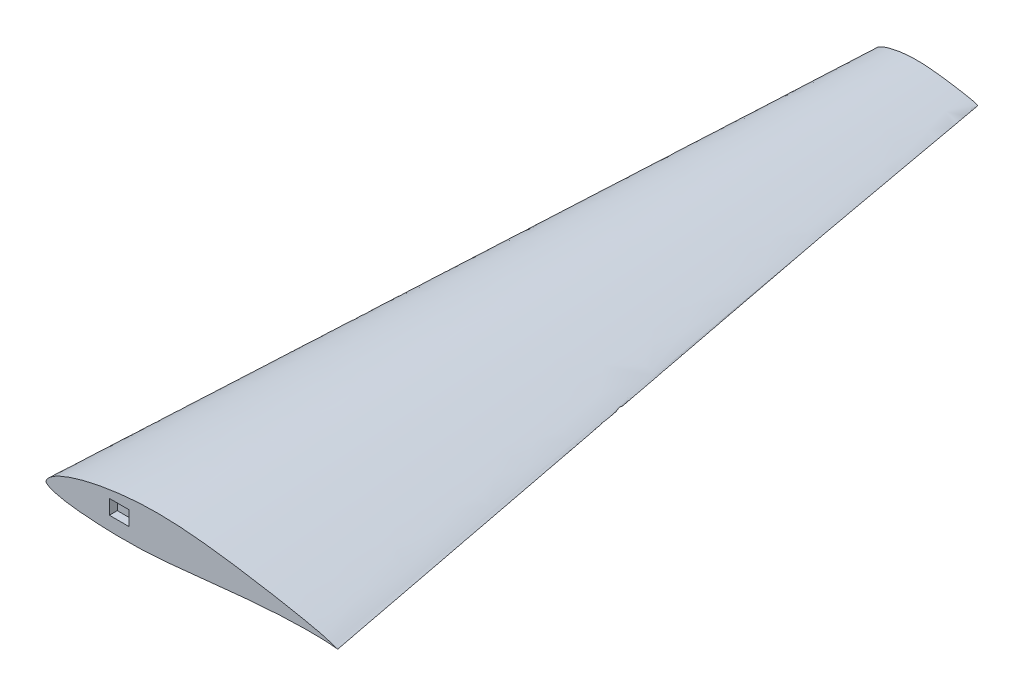
ISO-10303-21;
HEADER;
FILE_DESCRIPTION(('STEP AP214'),'2;1');
FILE_NAME('part.step','',(''),(''),'','','');
FILE_SCHEMA(('AUTOMOTIVE_DESIGN { 1 0 10303 214 1 1 1 1 }'));
ENDSEC;
DATA;
#1=APPLICATION_CONTEXT('core data for automotive mechanical design processes');
#2=APPLICATION_PROTOCOL_DEFINITION('international standard','automotive_design',2000,#1);
#3=PRODUCT_CONTEXT('',#1,'mechanical');
#4=PRODUCT('Part','Part','',(#3));
#5=PRODUCT_RELATED_PRODUCT_CATEGORY('part','',(#4));
#6=PRODUCT_DEFINITION_FORMATION('','',#4);
#7=PRODUCT_DEFINITION_CONTEXT('part definition',#1,'design');
#8=PRODUCT_DEFINITION('design','',#6,#7);
#9=PRODUCT_DEFINITION_SHAPE('','',#8);
#10=(LENGTH_UNIT() NAMED_UNIT(*) SI_UNIT(.MILLI.,.METRE.));
#11=(NAMED_UNIT(*) PLANE_ANGLE_UNIT() SI_UNIT($,.RADIAN.));
#12=(NAMED_UNIT(*) SI_UNIT($,.STERADIAN.) SOLID_ANGLE_UNIT());
#13=UNCERTAINTY_MEASURE_WITH_UNIT(LENGTH_MEASURE(1.E-05),#10,'distance_accuracy_value','');
#14=(GEOMETRIC_REPRESENTATION_CONTEXT(3) GLOBAL_UNCERTAINTY_ASSIGNED_CONTEXT((#13)) GLOBAL_UNIT_ASSIGNED_CONTEXT((#10,
#11,#12)) REPRESENTATION_CONTEXT('',''));
#15=CARTESIAN_POINT('',(0.,0.,0.));
#16=DIRECTION('',(0.,0.,1.));
#17=DIRECTION('',(1.,0.,0.));
#18=AXIS2_PLACEMENT_3D('',#15,#16,#17);
#19=CARTESIAN_POINT('',(-1152.26626391296,-12.2003702878728,-60.));
#20=DIRECTION('',(0.,0.,1.));
#21=DIRECTION('',(-1.,0.,0.));
#22=AXIS2_PLACEMENT_3D('',#19,#20,#21);
#23=PLANE('',#22);
#24=CARTESIAN_POINT('',(1122.2058981927,-30.8287655417814,-60.));
#25=CARTESIAN_POINT('',(1122.20115465393,-30.616714157466,-60.));
#26=CARTESIAN_POINT('',(1105.88259010497,-26.302372430673,-60.));
#27=CARTESIAN_POINT('',(1090.45754080574,-20.128829088461,-60.));
#28=CARTESIAN_POINT('',(1054.9512815124,-7.99563699588107,-60.));
#29=CARTESIAN_POINT('',(1012.29599935876,4.66375979651589,-60.));
#30=CARTESIAN_POINT('',(957.04784294867,17.8507612083849,-60.));
#31=CARTESIAN_POINT('',(891.716447525941,32.0367462273664,-60.));
#32=CARTESIAN_POINT('',(816.215341075556,47.3863666228463,-60.));
#33=CARTESIAN_POINT('',(731.9107718024,63.6704700489651,-60.));
#34=CARTESIAN_POINT('',(639.904104118504,80.6119651921873,-60.));
#35=CARTESIAN_POINT('',(541.510109284894,97.9167515276931,-60.));
#36=CARTESIAN_POINT('',(438.007613140291,115.09581096489,-60.));
#37=CARTESIAN_POINT('',(330.759268640408,131.748835691453,-60.));
#38=CARTESIAN_POINT('',(221.067545036545,147.33360763959,-60.));
#39=CARTESIAN_POINT('',(110.235704933439,161.251005054439,-60.));
#40=CARTESIAN_POINT('',(-0.492989421787764,172.997502315641,-60.));
#41=CARTESIAN_POINT('',(-110.055608812469,181.858679944371,-60.));
#42=CARTESIAN_POINT('',(-217.651628228843,186.906082107041,-60.));
#43=CARTESIAN_POINT('',(-322.67239779899,187.859019165266,-60.));
#44=CARTESIAN_POINT('',(-424.675493361954,184.483085412563,-60.));
#45=CARTESIAN_POINT('',(-523.162611524368,176.999526502167,-60.));
#46=CARTESIAN_POINT('',(-617.503498840836,166.17093241627,-60.));
#47=CARTESIAN_POINT('',(-706.884266129657,152.666711489326,-60.));
#48=CARTESIAN_POINT('',(-790.352428612782,136.7369598375,-60.));
#49=CARTESIAN_POINT('',(-867.056319021184,118.888986738304,-60.));
#50=CARTESIAN_POINT('',(-936.208246875165,99.5088027623838,-60.));
#51=CARTESIAN_POINT('',(-997.069117294322,79.0241834004041,-60.));
#52=CARTESIAN_POINT('',(-1049.04466548759,57.9027726884214,-60.));
#53=CARTESIAN_POINT('',(-1091.63364572143,36.4478589204407,-60.));
#54=CARTESIAN_POINT('',(-1124.4685862203,15.1942829283517,-60.));
#55=CARTESIAN_POINT('',(-1143.38688648303,-1.40670261872229,-60.));
#56=CARTESIAN_POINT('',(-1153.8658987359,-14.0298144732624,-60.));
#57=CARTESIAN_POINT('',(-1158.69837124572,-21.3015870958212,-60.));
#58=CARTESIAN_POINT('',(-1161.96116557527,-29.0987523051228,-60.));
#59=CARTESIAN_POINT('',(-1162.89877256632,-33.8886922166885,-60.));
#60=CARTESIAN_POINT('',(-1162.72232265553,-37.2464304163831,-60.));
#61=CARTESIAN_POINT('',(-1161.37641018475,-40.4051635389474,-60.));
#62=CARTESIAN_POINT('',(-1158.2300863755,-44.4654169714448,-60.));
#63=CARTESIAN_POINT('',(-1151.51850668726,-50.6376219777177,-60.));
#64=CARTESIAN_POINT('',(-1138.20791379313,-59.2163676999068,-60.));
#65=CARTESIAN_POINT('',(-1113.63504585877,-70.0566519156926,-60.));
#66=CARTESIAN_POINT('',(-1076.23988302444,-81.3980510511196,-60.));
#67=CARTESIAN_POINT('',(-1026.0445928557,-92.1030957383134,-60.));
#68=CARTESIAN_POINT('',(-965.229779180064,-101.401943352952,-60.));
#69=CARTESIAN_POINT('',(-894.477580423596,-109.465652354948,-60.));
#70=CARTESIAN_POINT('',(-814.631371427864,-116.09531772094,-60.));
#71=CARTESIAN_POINT('',(-726.709924863051,-121.102769823313,-60.));
#72=CARTESIAN_POINT('',(-631.81325792365,-124.293074846313,-60.));
#73=CARTESIAN_POINT('',(-530.963310823338,-125.211188342904,-60.));
#74=CARTESIAN_POINT('',(-425.034225737718,-123.236314136182,-60.));
#75=CARTESIAN_POINT('',(-314.643586800013,-117.974381898108,-60.));
#76=CARTESIAN_POINT('',(-200.156938848306,-109.126499791224,-60.));
#77=CARTESIAN_POINT('',(-81.9662502529353,-97.1903427138153,-60.));
#78=CARTESIAN_POINT('',(39.2547979910437,-83.9633310166969,-60.));
#79=CARTESIAN_POINT('',(162.164059051418,-70.4688237938537,-60.));
#80=CARTESIAN_POINT('',(285.030589665615,-57.6215109480256,-60.));
#81=CARTESIAN_POINT('',(406.008310953053,-46.0046138520639,-60.));
#82=CARTESIAN_POINT('',(523.188405612224,-36.2734456824879,-60.));
#83=CARTESIAN_POINT('',(634.631068124435,-28.7415065353594,-60.));
#84=CARTESIAN_POINT('',(738.378890591227,-23.5276764186368,-60.));
#85=CARTESIAN_POINT('',(832.710900485001,-20.777613140111,-60.));
#86=CARTESIAN_POINT('',(915.531746960598,-20.0924410267603,-60.));
#87=CARTESIAN_POINT('',(986.359954304663,-21.3847433442597,-60.));
#88=CARTESIAN_POINT('',(1040.98056697541,-23.3379611282725,-60.));
#89=CARTESIAN_POINT('',(1085.64373290725,-26.9172743422512,-60.));
#90=CARTESIAN_POINT('',(1104.13634536753,-28.0221898809687,-60.));
#91=CARTESIAN_POINT('',(1122.21079812224,-31.0478080945832,-60.));
#92=CARTESIAN_POINT('',(1122.2058981927,-30.8287655417814,-60.));
#93=B_SPLINE_CURVE_WITH_KNOTS('',3,(#24,#25,#26,#27,#28,#29,#30,#31,#32,#33,#34,#35,#36,#37,#38,
#39,#40,#41,#42,#43,#44,#45,#46,#47,#48,#49,#50,#51,#52,#53,#54,#55,#56,#57,#58,#59,#60,#61,#62,
#63,#64,#65,#66,#67,#68,#69,#70,#71,#72,#73,#74,#75,#76,#77,#78,#79,#80,#81,#82,#83,#84,#85,#86,
#87,#88,#89,#90,#91,#92),.UNSPECIFIED.,.T.,.F.,(4,1,1,1,1,1,1,1,1,1,1,1,1,1,1,1,1,1,1,1,1,1,1,1,
1,1,1,1,1,1,1,1,1,1,1,1,1,1,1,1,1,1,1,1,1,1,1,1,1,1,1,1,1,1,1,1,1,1,1,1,1,1,1,1,1,1,4),(0.,
0.00178025429931348,0.00677661855276226,0.014307631931115,0.0240462466109695,0.0361164032384218,
0.0505469730630571,0.0671298835400742,0.0856244289456062,0.10576729194862,0.127282098412942,
0.149864114045041,0.173229760189317,0.197069077892929,0.221103034083199,0.245051957369849,
0.268663179942347,0.291772797822348,0.314298508345449,0.336177511433891,0.357377359215959,
0.377791670496789,0.397224888102935,0.415489312865215,0.432417328029751,0.447849235180273,
0.461650757544391,0.473686992386839,0.483898395757803,0.492262508108233,0.498796820958936,
0.499955027372734,0.502810607326279,0.504371243067385,0.50535998755193,0.505924933279694,
0.506503368203689,0.507535007041587,0.509204749770686,0.512345281497249,0.517665407870953,
0.526421681932562,0.537424925562334,0.550643204547595,0.565965823835836,0.583206168779579,
0.6021549785986,0.622586582637333,0.644254823208852,0.666997978581174,0.690702845759673,
0.715307475272001,0.740824202204505,0.767084355637659,0.793717038600972,0.82033109971691,
0.846519300878587,0.871863223081629,0.895937170924907,0.918334876492831,0.938667169413558,
0.956573464196435,0.971715275283217,0.983839006179547,0.992717916559063,0.998161052107173,1.),.UNSPECIFIED.);
#94=CARTESIAN_POINT('',(1122.2058981927,-30.8287655417814,-60.));
#95=VERTEX_POINT('',#94);
#96=EDGE_CURVE('E75',#95,#95,#93,.T.);
#97=ORIENTED_EDGE('',*,*,#96,.T.);
#98=EDGE_LOOP('',(#97));
#99=FACE_BOUND('',#98,.T.);
#100=DIRECTION('',(1.,0.,0.));
#101=VECTOR('',#100,1.);
#102=CARTESIAN_POINT('',(-513.594303372642,97.9458802101725,-60.));
#103=LINE('',#102,#101);
#104=CARTESIAN_POINT('',(-666.619485216032,97.9458802101725,-60.));
#105=VERTEX_POINT('',#104);
#106=CARTESIAN_POINT('',(-513.594303372642,97.9458802101725,-60.));
#107=VERTEX_POINT('',#106);
#108=EDGE_CURVE('E113',#105,#107,#103,.T.);
#109=ORIENTED_EDGE('',*,*,#108,.T.);
#110=DIRECTION('',(0.,-1.,0.));
#111=VECTOR('',#110,1.);
#112=CARTESIAN_POINT('',(-513.594303372642,97.9458802101725,-60.));
#113=LINE('',#112,#111);
#114=CARTESIAN_POINT('',(-513.594303372642,-16.2780466428138,-60.));
#115=VERTEX_POINT('',#114);
#116=EDGE_CURVE('E90',#107,#115,#113,.T.);
#117=ORIENTED_EDGE('',*,*,#116,.T.);
#118=DIRECTION('',(-1.,0.,0.));
#119=VECTOR('',#118,1.);
#120=CARTESIAN_POINT('',(-513.594303372642,-16.2780466428138,-60.));
#121=LINE('',#120,#119);
#122=CARTESIAN_POINT('',(-666.619485216032,-16.2780466428138,-60.));
#123=VERTEX_POINT('',#122);
#124=EDGE_CURVE('E142',#115,#123,#121,.T.);
#125=ORIENTED_EDGE('',*,*,#124,.T.);
#126=DIRECTION('',(0.,1.,0.));
#127=VECTOR('',#126,1.);
#128=CARTESIAN_POINT('',(-666.619485216032,97.9458802101725,-60.));
#129=LINE('',#128,#127);
#130=EDGE_CURVE('E135',#123,#105,#129,.T.);
#131=ORIENTED_EDGE('',*,*,#130,.T.);
#132=EDGE_LOOP('',(#109,#117,#125,#131));
#133=FACE_BOUND('',#132,.T.);
#134=ADVANCED_FACE('F63',(#99,#133),#23,.T.);
#135=CARTESIAN_POINT('',(-856.653077521207,-40.6182657315667,-6260.));
#136=DIRECTION('',(0.,0.,1.));
#137=DIRECTION('',(-1.,0.,0.));
#138=AXIS2_PLACEMENT_3D('',#135,#136,#137);
#139=PLANE('',#138);
#140=CARTESIAN_POINT('',(-62.768795980493,-35.2354448345607,-6260.));
#141=CARTESIAN_POINT('',(-62.7715594343637,-35.161464044046,-6260.));
#142=CARTESIAN_POINT('',(-68.4892533402153,-33.7410304315181,-6260.));
#143=CARTESIAN_POINT('',(-73.904826244995,-31.6670699807893,-6260.));
#144=CARTESIAN_POINT('',(-86.3598466861363,-27.6181263346662,-6260.));
#145=CARTESIAN_POINT('',(-101.312613463051,-23.4228917248776,-6260.));
#146=CARTESIAN_POINT('',(-120.663028845652,-19.1093216631822,-6260.));
#147=CARTESIAN_POINT('',(-143.537697318301,-14.4997928532483,-6260.));
#148=CARTESIAN_POINT('',(-169.96765777261,-9.5372939208794,-6260.));
#149=CARTESIAN_POINT('',(-199.474894570233,-4.29466001199642,-6260.));
#150=CARTESIAN_POINT('',(-231.673585589033,1.13715909285272,-6260.));
#151=CARTESIAN_POINT('',(-266.103341203516,6.66239247620247,-6260.));
#152=CARTESIAN_POINT('',(-302.315298237174,12.1170555043395,-6260.));
#153=CARTESIAN_POINT('',(-339.831801501577,17.3685612770775,-6260.));
#154=CARTESIAN_POINT('',(-378.195458339637,22.2344819950382,-6260.));
#155=CARTESIAN_POINT('',(-416.948301893932,26.5125347132972,-6260.));
#156=CARTESIAN_POINT('',(-455.653804819709,30.0334858752315,-6260.));
#157=CARTESIAN_POINT('',(-493.937273776908,32.5535580846316,-6260.));
#158=CARTESIAN_POINT('',(-531.514475712799,33.7529045585345,-6260.));
#159=CARTESIAN_POINT('',(-568.17152624748,33.5367452774346,-6260.));
#160=CARTESIAN_POINT('',(-603.752795326995,31.8255847079449,-6260.));
#161=CARTESIAN_POINT('',(-638.085531914352,28.6992408412461,-6260.));
#162=CARTESIAN_POINT('',(-670.953763146873,24.4271493642645,-6260.));
#163=CARTESIAN_POINT('',(-702.076940726259,19.2471852213284,-6260.));
#164=CARTESIAN_POINT('',(-731.123955821754,13.2516082607377,-6260.));
#165=CARTESIAN_POINT('',(-757.800228679982,6.62191851956731,-6260.));
#166=CARTESIAN_POINT('',(-781.832873554333,-0.503051287442359,-6260.));
#167=CARTESIAN_POINT('',(-802.96618270177,-7.97014647053786,-6260.));
#168=CARTESIAN_POINT('',(-820.995202148996,-15.6130550209624,-6260.));
#169=CARTESIAN_POINT('',(-835.74658265942,-23.3233108305785,-6260.));
#170=CARTESIAN_POINT('',(-847.09487174238,-30.9123353139702,-6260.));
#171=CARTESIAN_POINT('',(-853.610586604553,-36.8048992419908,-6260.));
#172=CARTESIAN_POINT('',(-857.201788544685,-41.2650967461758,-6260.));
#173=CARTESIAN_POINT('',(-858.850318344285,-43.828182757875,-6260.));
#174=CARTESIAN_POINT('',(-859.94828793429,-46.5664283398626,-6260.));
#175=CARTESIAN_POINT('',(-860.250483793828,-48.2430082792743,-6260.));
#176=CARTESIAN_POINT('',(-860.171358916499,-49.4139312981977,-6260.));
#177=CARTESIAN_POINT('',(-859.685133378202,-50.5092914480428,-6260.));
#178=CARTESIAN_POINT('',(-858.565856882824,-51.9098735302076,-6260.));
#179=CARTESIAN_POINT('',(-856.191277168439,-54.0288947151431,-6260.));
#180=CARTESIAN_POINT('',(-851.501078818877,-56.9533147580623,-6260.));
#181=CARTESIAN_POINT('',(-842.868548954772,-60.6081626209987,-6260.));
#182=CARTESIAN_POINT('',(-829.75844147582,-64.3709023541952,-6260.));
#183=CARTESIAN_POINT('',(-812.184436093652,-67.8446748921428,-6260.));
#184=CARTESIAN_POINT('',(-790.911582287878,-70.772200095514,-6260.));
#185=CARTESIAN_POINT('',(-766.177051439535,-73.2167412462913,-6260.));
#186=CARTESIAN_POINT('',(-738.276219223052,-75.1132874538173,-6260.));
#187=CARTESIAN_POINT('',(-707.56561876685,-76.4014909147392,-6260.));
#188=CARTESIAN_POINT('',(-674.43017274413,-77.0190676374616,-6260.));
#189=CARTESIAN_POINT('',(-639.228914169513,-76.8125475071701,-6260.));
#190=CARTESIAN_POINT('',(-602.270160843118,-75.5698410912889,-6260.));
#191=CARTESIAN_POINT('',(-563.771507600199,-73.1566453823038,-6260.));
#192=CARTESIAN_POINT('',(-523.862090680234,-69.4705576020164,-6260.));
#193=CARTESIAN_POINT('',(-482.676106035862,-64.6873134822189,-6260.));
#194=CARTESIAN_POINT('',(-440.43927569069,-59.4377296716919,-6260.));
#195=CARTESIAN_POINT('',(-397.614659582081,-54.0859694749774,-6260.));
#196=CARTESIAN_POINT('',(-354.801574741511,-48.9603022904963,-6260.));
#197=CARTESIAN_POINT('',(-312.641252257449,-44.2739171415237,-6260.));
#198=CARTESIAN_POINT('',(-271.796442142331,-40.2654907769843,-6260.));
#199=CARTESIAN_POINT('',(-232.942495214821,-37.0545696704387,-6260.));
#200=CARTESIAN_POINT('',(-196.761922382884,-34.6928701852552,-6260.));
#201=CARTESIAN_POINT('',(-163.854579095046,-33.2402187187982,-6260.));
#202=CARTESIAN_POINT('',(-134.953823384428,-32.5683565258773,-6260.));
#203=CARTESIAN_POINT('',(-110.228146214666,-32.6492910205264,-6260.));
#204=CARTESIAN_POINT('',(-91.155438971044,-33.0455684548176,-6260.));
#205=CARTESIAN_POINT('',(-75.5493675084802,-34.0613780335465,-6260.));
#206=CARTESIAN_POINT('',(-69.0897037754122,-34.3503679361492,-6260.));
#207=CARTESIAN_POINT('',(-62.7659414177071,-35.311864713945,-6260.));
#208=CARTESIAN_POINT('',(-62.768795980493,-35.2354448345607,-6260.));
#209=B_SPLINE_CURVE_WITH_KNOTS('',3,(#140,#141,#142,#143,#144,#145,#146,#147,#148,#149,#150,
#151,#152,#153,#154,#155,#156,#157,#158,#159,#160,#161,#162,#163,#164,#165,#166,#167,#168,#169,
#170,#171,#172,#173,#174,#175,#176,#177,#178,#179,#180,#181,#182,#183,#184,#185,#186,#187,#188,
#189,#190,#191,#192,#193,#194,#195,#196,#197,#198,#199,#200,#201,#202,#203,#204,#205,#206,#207,
#208),.UNSPECIFIED.,.T.,.F.,(4,1,1,1,1,1,1,1,1,1,1,1,1,1,1,1,1,1,1,1,1,1,1,1,1,1,1,1,1,1,1,1,1,
1,1,1,1,1,1,1,1,1,1,1,1,1,1,1,1,1,1,1,1,1,1,1,1,1,1,1,1,1,1,1,1,1,4),(0.,0.00178025429931348,
0.00677661855276226,0.014307631931115,0.0240462466109695,0.0361164032384218,0.0505469730630571,
0.0671298835400742,0.0856244289456062,0.10576729194862,0.127282098412942,0.149864114045041,
0.173229760189317,0.197069077892929,0.221103034083199,0.245051957369849,0.268663179942347,
0.291772797822348,0.314298508345449,0.336177511433891,0.357377359215959,0.377791670496789,
0.397224888102935,0.415489312865215,0.432417328029751,0.447849235180273,0.461650757544391,
0.473686992386839,0.483898395757803,0.492262508108233,0.498796820958936,0.499955027372734,
0.502810607326279,0.504371243067385,0.50535998755193,0.505924933279694,0.506503368203689,
0.507535007041587,0.509204749770686,0.512345281497249,0.517665407870953,0.526421681932562,
0.537424925562334,0.550643204547595,0.565965823835836,0.583206168779579,0.6021549785986,
0.622586582637333,0.644254823208852,0.666997978581174,0.690702845759673,0.715307475272001,
0.740824202204505,0.767084355637659,0.793717038600972,0.82033109971691,0.846519300878587,
0.871863223081629,0.895937170924907,0.918334876492831,0.938667169413558,0.956573464196435,
0.971715275283217,0.983839006179547,0.992717916559063,0.998161052107173,1.),.UNSPECIFIED.);
#210=CARTESIAN_POINT('',(-62.768795980493,-35.2354448345607,-6260.));
#211=VERTEX_POINT('',#210);
#212=EDGE_CURVE('E14',#211,#211,#209,.T.);
#213=ORIENTED_EDGE('',*,*,#212,.F.);
#214=EDGE_LOOP('',(#213));
#215=FACE_BOUND('',#214,.T.);
#216=ADVANCED_FACE('F65',(#215),#139,.F.);
#217=CARTESIAN_POINT('',(-829.212772496665,127.551706357056,-60.));
#218=CARTESIAN_POINT('',(-729.58238945558,13.4038053108561,-6260.));
#219=CARTESIAN_POINT('',(-831.317274890692,127.061718606732,-60.));
#220=CARTESIAN_POINT('',(-730.318211721742,13.2383485653586,-6260.));
#221=CARTESIAN_POINT('',(-844.668148264337,123.928740686031,-60.));
#222=CARTESIAN_POINT('',(-734.986497610126,12.1809427873616,-6260.));
#223=CARTESIAN_POINT('',(-872.329771938532,117.109052219102,-60.));
#224=CARTESIAN_POINT('',(-744.662471920196,9.88696426547185,-6260.));
#225=CARTESIAN_POINT('',(-906.646678696621,107.793584513178,-60.));
#226=CARTESIAN_POINT('',(-756.67522169935,6.77052491164006,-6260.));
#227=CARTESIAN_POINT('',(-943.806753069503,96.7062821112164,-60.));
#228=CARTESIAN_POINT('',(-769.701597856569,3.09351386462406,-6260.));
#229=CARTESIAN_POINT('',(-972.975630231256,87.1335960359868,-60.));
#230=CARTESIAN_POINT('',(-779.941039136108,-0.0587731598857236,-6260.));
#231=CARTESIAN_POINT('',(-1007.05666113912,74.800467805899,-60.));
#232=CARTESIAN_POINT('',(-791.937939174986,-4.07350427681673,-6260.));
#233=CARTESIAN_POINT('',(-1030.66516722207,65.3716873038617,-60.));
#234=CARTESIAN_POINT('',(-800.271635923456,-7.11409770871183,-6260.));
#235=CARTESIAN_POINT('',(-1061.25131138476,51.6962297013703,-60.));
#236=CARTESIAN_POINT('',(-811.137073165823,-11.4339714874833,-6260.));
#237=CARTESIAN_POINT('',(-1079.00722114432,42.8086322710204,-60.));
#238=CARTESIAN_POINT('',(-817.485959529064,-14.1945671402748,-6260.));
#239=CARTESIAN_POINT('',(-1104.0563484032,28.4068254523512,-60.));
#240=CARTESIAN_POINT('',(-826.581899048501,-18.5570678431818,-6260.));
#241=CARTESIAN_POINT('',(-1117.40931977586,19.7636426879801,-60.));
#242=CARTESIAN_POINT('',(-831.50107274205,-21.1272097641271,-6260.));
#243=CARTESIAN_POINT('',(-1135.66170921193,5.37221274075266,-60.));
#244=CARTESIAN_POINT('',(-838.462484807711,-25.2462877286109,-6260.));
#245=CARTESIAN_POINT('',(-1144.51533440074,-2.76604107005167,-60.));
#246=CARTESIAN_POINT('',(-841.975859971961,-27.5093717871831,-6260.));
#247=CARTESIAN_POINT('',(-1152.82466426129,-12.7755341152811,-60.));
#248=CARTESIAN_POINT('',(-845.654984774398,-30.176591122042,-6260.));
#249=CARTESIAN_POINT('',(-1156.43685610927,-17.8985208970397,-60.));
#250=CARTESIAN_POINT('',(-847.387479055175,-31.5040720435642,-6260.));
#251=CARTESIAN_POINT('',(-1159.78948712803,-23.9090486571599,-60.));
#252=CARTESIAN_POINT('',(-849.254612158242,-33.0194591670761,-6260.));
#253=CARTESIAN_POINT('',(-1161.96116557527,-29.0987523051228,-60.));
#254=CARTESIAN_POINT('',(-850.738397935686,-34.2990813241094,-6260.));
#255=CARTESIAN_POINT('',(-1162.89877256632,-33.8886922166885,-60.));
#256=CARTESIAN_POINT('',(-851.981208617759,-35.4505936480285,-6260.));
#257=CARTESIAN_POINT('',(-1162.72232265553,-37.2464304163831,-60.));
#258=CARTESIAN_POINT('',(-852.811957439663,-36.2586543969076,-6260.));
#259=CARTESIAN_POINT('',(-1161.37641018475,-40.4051635389474,-60.));
#260=CARTESIAN_POINT('',(-853.643168007229,-37.0983983043348,-6260.));
#261=CARTESIAN_POINT('',(-1159.10106133558,-43.3414452235634,-60.));
#262=CARTESIAN_POINT('',(-854.522834034568,-38.0388249855981,-6260.));
#263=CARTESIAN_POINT('',(-1156.16964821432,-46.3602684556404,-60.));
#264=CARTESIAN_POINT('',(-855.486598587112,-39.1434251619636,-6260.));
#265=CARTESIAN_POINT('',(-1153.91361001837,-48.3250763254306,-60.));
#266=CARTESIAN_POINT('',(-856.144369435414,-39.9518043859372,-6260.));
#267=CARTESIAN_POINT('',(-1149.03786328623,-52.2298240683766,-60.));
#268=CARTESIAN_POINT('',(-857.470291301179,-41.6825569943552,-6260.));
#269=CARTESIAN_POINT('',(-1144.90446537918,-54.8737396933434,-60.));
#270=CARTESIAN_POINT('',(-858.399044100502,-43.1265547363725,-6260.));
#271=CARTESIAN_POINT('',(-1138.9181686672,-58.2614101000769,-60.));
#272=CARTESIAN_POINT('',(-859.437447764451,-45.2924350973393,-6260.));
#273=CARTESIAN_POINT('',(-1135.4091253734,-60.1148944181189,-60.));
#274=CARTESIAN_POINT('',(-859.951652511742,-46.5850949856236,-6260.));
#275=CARTESIAN_POINT('',(-1131.08615349649,-62.1841176949411,-60.));
#276=CARTESIAN_POINT('',(-860.250483793828,-48.2430082792743,-6260.));
#277=CARTESIAN_POINT('',(-1128.06274934849,-63.5521161542971,-60.));
#278=CARTESIAN_POINT('',(-860.171358916499,-49.4139312981977,-6260.));
#279=CARTESIAN_POINT('',(-1124.95796674343,-64.9026058966147,-60.));
#280=CARTESIAN_POINT('',(-859.685133378202,-50.5092914480428,-6260.));
#281=CARTESIAN_POINT('',(-1121.73341081225,-66.2335443462341,-60.));
#282=CARTESIAN_POINT('',(-858.920544702188,-51.4660427103745,-6260.));
#283=CARTESIAN_POINT('',(-1117.82043818841,-67.7747409487299,-60.));
#284=CARTESIAN_POINT('',(-857.890282720745,-52.5127406198101,-6260.));
#285=CARTESIAN_POINT('',(-1110.81630996231,-70.4178750778562,-60.));
#286=CARTESIAN_POINT('',(-855.899412613526,-54.2108773287962,-6260.));
#287=CARTESIAN_POINT('',(-1097.91346925882,-74.794649303126,-60.));
#288=CARTESIAN_POINT('',(-851.845410916671,-56.738617721144,-6260.));
#289=CARTESIAN_POINT('',(-1085.2426026253,-78.3923142275133,-60.));
#290=CARTESIAN_POINT('',(-847.631826926625,-58.5914819271515,-6260.));
#291=CARTESIAN_POINT('',(-1064.0438471973,-83.8943130669101,-60.));
#292=CARTESIAN_POINT('',(-840.476286073484,-61.2947674112436,-6260.));
#293=CARTESIAN_POINT('',(-1047.31549656837,-87.5396152358559,-60.));
#294=CARTESIAN_POINT('',(-834.724461756159,-62.9456019243787,-6260.));
#295=CARTESIAN_POINT('',(-1017.11718752095,-93.2604952047965,-60.));
#296=CARTESIAN_POINT('',(-824.291101711021,-65.4516061731355,-6260.));
#297=CARTESIAN_POINT('',(-994.512717814773,-96.9244555894391,-60.));
#298=CARTESIAN_POINT('',(-816.441328873008,-66.9737211472728,-6260.));
#299=CARTESIAN_POINT('',(-959.517300940798,-101.820414140808,-60.));
#300=CARTESIAN_POINT('',(-804.264962226887,-68.9345361563659,-6260.));
#301=CARTESIAN_POINT('',(-930.120025114471,-105.403442174085,-60.));
#302=CARTESIAN_POINT('',(-794.016105143911,-70.2929791921303,-6260.));
#303=CARTESIAN_POINT('',(-891.7247045248,-109.432084324852,-60.));
#304=CARTESIAN_POINT('',(-780.62423199707,-71.7889103485822,-6260.));
#305=CARTESIAN_POINT('',(-856.001094532176,-112.660371667584,-60.));
#306=CARTESIAN_POINT('',(-768.158231439812,-72.9520154340786,-6260.));
#307=CARTESIAN_POINT('',(-814.532681305565,-115.819272508077,-60.));
#308=CARTESIAN_POINT('',(-753.685229767612,-74.0658670656631,-6260.));
#309=CARTESIAN_POINT('',(-773.108617956048,-118.460192359524,-60.));
#310=CARTESIAN_POINT('',(-739.225029964666,-74.9682045357942,-6260.));
#311=CARTESIAN_POINT('',(-728.921749644987,-120.727861061569,-60.));
#312=CARTESIAN_POINT('',(-723.800256947369,-75.7205039988114,-6260.));
#313=CARTESIAN_POINT('',(-682.487865335895,-122.589459115857,-60.));
#314=CARTESIAN_POINT('',(-707.590660019816,-76.3097386548065,-6260.));
#315=CARTESIAN_POINT('',(-635.955138152636,-123.896306526208,-60.));
#316=CARTESIAN_POINT('',(-691.347393323977,-76.7037653585633,-6260.));
#317=CARTESIAN_POINT('',(-585.260805311164,-124.716877101761,-60.));
#318=CARTESIAN_POINT('',(-673.652310293935,-76.9209585080612,-6260.));
#319=CARTESIAN_POINT('',(-536.786168998662,-124.87048910916,-60.));
#320=CARTESIAN_POINT('',(-656.732725680856,-76.9152395579744,-6260.));
#321=CARTESIAN_POINT('',(-482.492900731309,-124.307536974608,-60.));
#322=CARTESIAN_POINT('',(-637.783141412262,-76.6600050768735,-6260.));
#323=CARTESIAN_POINT('',(-432.360602340538,-123.075537445922,-60.));
#324=CARTESIAN_POINT('',(-620.286570420433,-76.1756274276176,-6260.));
#325=CARTESIAN_POINT('',(-374.939789857097,-120.848489139018,-60.));
#326=CARTESIAN_POINT('',(-600.247094685126,-75.335952800521,-6260.));
#327=CARTESIAN_POINT('',(-323.370046071191,-118.09044414298,-60.));
#328=CARTESIAN_POINT('',(-582.250512499396,-74.3149574678638,-6260.));
#329=CARTESIAN_POINT('',(-263.15085491722,-113.994864380462,-60.));
#330=CARTESIAN_POINT('',(-561.236484633782,-72.8146584269182,-6260.));
#331=CARTESIAN_POINT('',(-210.284693563039,-109.67206859194,-60.));
#332=CARTESIAN_POINT('',(-542.791640178183,-71.2189164224588,-6260.));
#333=CARTESIAN_POINT('',(-147.384354844682,-103.796961064155,-60.));
#334=CARTESIAN_POINT('',(-520.84910067178,-69.0353288010891,-6260.));
#335=CARTESIAN_POINT('',(-93.2092486238008,-98.2450851262363,-60.));
#336=CARTESIAN_POINT('',(-501.958483832971,-66.9267238304267,-6260.));
#337=CARTESIAN_POINT('',(-27.8304514469903,-91.2833252905878,-60.));
#338=CARTESIAN_POINT('',(-479.169318703095,-64.2226178676051,-6260.));
#339=CARTESIAN_POINT('',(27.4540158470234,-85.2442429686546,-60.));
#340=CARTESIAN_POINT('',(-459.902845380998,-61.8568420791878,-6260.));
#341=CARTESIAN_POINT('',(94.5362159736375,-77.8938494510345,-60.));
#342=CARTESIAN_POINT('',(-436.529026607753,-58.9466915980994,-6260.));
#343=CARTESIAN_POINT('',(150.399084420195,-71.8126718103479,-60.));
#344=CARTESIAN_POINT('',(-417.066692698759,-56.516875482751,-6260.));
#345=CARTESIAN_POINT('',(218.052527080542,-64.6249489024986,-60.));
#346=CARTESIAN_POINT('',(-393.498661069387,-53.6114048020775,-6260.));
#347=CARTESIAN_POINT('',(273.92088784551,-58.8690589705035,-60.));
#348=CARTESIAN_POINT('',(-374.036459080019,-51.2631406825048,-6260.));
#349=CARTESIAN_POINT('',(340.93858887613,-52.2529400511864,-60.));
#350=CARTESIAN_POINT('',(-350.690306423905,-48.5329519861592,-6260.));
#351=CARTESIAN_POINT('',(396.199038728307,-47.0789112281331,-60.));
#352=CARTESIAN_POINT('',(-331.439751588612,-46.3634886366619,-6260.));
#353=CARTESIAN_POINT('',(461.320625473981,-41.4112276117029,-60.));
#354=CARTESIAN_POINT('',(-308.753293045658,-43.9374760795189,-6260.));
#355=CARTESIAN_POINT('',(515.337224217674,-37.0861281590095,-60.));
#356=CARTESIAN_POINT('',(-289.934159161162,-42.0454893345961,-6260.));
#357=CARTESIAN_POINT('',(577.258841300722,-32.6190531717214,-60.));
#358=CARTESIAN_POINT('',(-268.359116035545,-40.0354623226404,-6260.));
#359=CARTESIAN_POINT('',(629.366984438511,-29.2820134970874,-60.));
#360=CARTESIAN_POINT('',(-250.199918115741,-38.4807368379733,-6260.));
#361=CARTESIAN_POINT('',(686.772059362488,-26.1211694143586,-60.));
#362=CARTESIAN_POINT('',(-230.190766005176,-36.9362124693548,-6260.));
#363=CARTESIAN_POINT('',(736.328839140367,-23.8635086431708,-60.));
#364=CARTESIAN_POINT('',(-212.918893730077,-35.7475221137926,-6260.));
#365=CARTESIAN_POINT('',(788.002218715096,-22.0810063796398,-60.));
#366=CARTESIAN_POINT('',(-194.910643233478,-34.6870553327078,-6260.));
#367=CARTESIAN_POINT('',(834.38139659096,-20.9690165880571,-60.));
#368=CARTESIAN_POINT('',(-178.727987445247,-33.896785803602,-6260.));
#369=CARTESIAN_POINT('',(878.99634997574,-20.3946962708141,-60.));
#370=CARTESIAN_POINT('',(-163.142037505237,-33.3008697271638,-6260.));
#371=CARTESIAN_POINT('',(921.647415286621,-20.3694249005862,-60.));
#372=CARTESIAN_POINT('',(-148.295180486024,-32.8785059741675,-6260.));
#373=CARTESIAN_POINT('',(958.504069283349,-20.8764963319617,-60.));
#374=CARTESIAN_POINT('',(-135.510280924919,-32.6682439882748,-6260.));
#375=CARTESIAN_POINT('',(996.654106057196,-21.7998066323774,-60.));
#376=CARTESIAN_POINT('',(-122.064312897899,-32.6105477269651,-6260.));
#377=CARTESIAN_POINT('',(1023.59805672151,-22.7163674386636,-60.));
#378=CARTESIAN_POINT('',(-112.412379290161,-32.6760951790322,-6260.));
#379=CARTESIAN_POINT('',(1057.02471947582,-24.6237420587924,-60.));
#380=CARTESIAN_POINT('',(-101.18562116369,-32.8392427438664,-6260.));
#381=CARTESIAN_POINT('',(1077.49998130459,-26.2646327949135,-60.));
#382=CARTESIAN_POINT('',(-94.6941918255419,-33.009619548974,-6260.));
#383=CARTESIAN_POINT('',(1096.51434026752,-27.5667825182028,-60.));
#384=CARTESIAN_POINT('',(-86.6469975263049,-33.38193473273,-6260.));
#385=CARTESIAN_POINT('',(1105.67791723966,-28.2802451591675,-60.));
#386=CARTESIAN_POINT('',(-82.4375472939011,-33.6230395308461,-6260.));
#387=CARTESIAN_POINT('',(1126.62946792812,-31.7874823755161,-60.));
#388=CARTESIAN_POINT('',(-77.8876378359587,-33.8923268777434,-6260.));
#389=CARTESIAN_POINT('',(1116.86025871113,-29.2046751171854,-60.));
#390=CARTESIAN_POINT('',(-75.8364895855708,-34.0107507406302,-6260.));
#391=CARTESIAN_POINT('',(1103.491455609,-25.3453724132622,-60.));
#392=CARTESIAN_POINT('',(-72.5980037678546,-34.1890532113823,-6260.));
#393=CARTESIAN_POINT('',(1097.0452454279,-22.7845847338405,-60.));
#394=CARTESIAN_POINT('',(-70.1782586354595,-34.3016685957528,-6260.));
#395=CARTESIAN_POINT('',(1087.42865464012,-19.2546957028556,-60.));
#396=CARTESIAN_POINT('',(-65.1309262770274,-34.9522804675506,-6260.));
#397=CARTESIAN_POINT('',(1081.04664116436,-16.9830658815047,-60.));
#398=CARTESIAN_POINT('',(-61.2199683158535,-35.5469222749205,-6260.));
#399=CARTESIAN_POINT('',(1071.06563858708,-13.5486299785771,-60.));
#400=CARTESIAN_POINT('',(-66.8279435409385,-34.1537458231727,-6260.));
#401=CARTESIAN_POINT('',(1060.50819804484,-10.056396018161,-60.));
#402=CARTESIAN_POINT('',(-70.3089871261627,-33.0441409298406,-6260.));
#403=CARTESIAN_POINT('',(1041.50184695625,-4.01175525501411,-60.));
#404=CARTESIAN_POINT('',(-75.5982630233145,-31.1165586334904,-6260.));
#405=CARTESIAN_POINT('',(1027.26772968906,0.144425406295233,-60.));
#406=CARTESIAN_POINT('',(-81.045792296128,-29.3456471251182,-6260.));
#407=CARTESIAN_POINT('',(1001.62865513992,7.08739145621461,-60.));
#408=CARTESIAN_POINT('',(-90.3195702335817,-26.5071634259767,-6260.));
#409=CARTESIAN_POINT('',(982.966051303696,11.6644289870184,-60.));
#410=CARTESIAN_POINT('',(-96.5959040469761,-24.750384373016,-6260.));
#411=CARTESIAN_POINT('',(950.144604936312,19.2458146052146,-60.));
#412=CARTESIAN_POINT('',(-107.885024279721,-21.9577782391256,-6260.));
#413=CARTESIAN_POINT('',(924.33917366243,24.9530845168502,-60.));
#414=CARTESIAN_POINT('',(-116.957770807607,-19.9540324347636,-6260.));
#415=CARTESIAN_POINT('',(887.987857285188,32.69169943721,-60.));
#416=CARTESIAN_POINT('',(-129.689332312654,-17.2904097988158,-6260.));
#417=CARTESIAN_POINT('',(855.221667660565,39.456253618536,-60.));
#418=CARTESIAN_POINT('',(-141.121593196333,-15.0117776108221,-6260.));
#419=CARTESIAN_POINT('',(815.432732418883,47.4360612844001,-60.));
#420=CARTESIAN_POINT('',(-155.022712636192,-12.3433622240084,-6260.));
#421=CARTESIAN_POINT('',(776.394699370867,55.0780428107947,-60.));
#422=CARTESIAN_POINT('',(-168.679885661002,-9.8069256347877,-6260.));
#423=CARTESIAN_POINT('',(733.635824341301,63.2422481642765,-60.));
#424=CARTESIAN_POINT('',(-183.635091475217,-7.10896246212119,-6260.));
#425=CARTESIAN_POINT('',(689.091320489789,71.5549586921182,-60.));
#426=CARTESIAN_POINT('',(-199.21112548578,-4.37411488129265,-6260.));
#427=CARTESIAN_POINT('',(643.736426124317,79.8207718283999,-60.));
#428=CARTESIAN_POINT('',(-215.071766812031,-1.66351613818426,-6260.));
#429=CARTESIAN_POINT('',(594.501021823446,88.5971134669171,-60.));
#430=CARTESIAN_POINT('',(-232.290856730568,1.2051024671473,-6260.));
#431=CARTESIAN_POINT('',(546.979513719382,96.853397494808,-60.));
#432=CARTESIAN_POINT('',(-248.908737025029,3.9030292647919,-6260.));
#433=CARTESIAN_POINT('',(493.926468036363,105.814553336306,-60.));
#434=CARTESIAN_POINT('',(-267.458845845602,6.83009819304655,-6260.));
#435=CARTESIAN_POINT('',(444.688425495608,113.877854677755,-60.));
#436=CARTESIAN_POINT('',(-284.673943019988,9.45971091564532,-6260.));
#437=CARTESIAN_POINT('',(388.704102794846,122.75143101868,-60.));
#438=CARTESIAN_POINT('',(-304.246471705889,12.3485218576794,-6260.));
#439=CARTESIAN_POINT('',(338.176625068923,130.462695338541,-60.));
#440=CARTESIAN_POINT('',(-321.909051000222,14.8597606285237,-6260.));
#441=CARTESIAN_POINT('',(280.153653465495,138.9387762438,-60.));
#442=CARTESIAN_POINT('',(-342.189067406293,17.6201472223101,-6260.));
#443=CARTESIAN_POINT('',(228.796399931964,146.066997243604,-60.));
#444=CARTESIAN_POINT('',(-360.136717597646,19.9439704025782,-6260.));
#445=CARTESIAN_POINT('',(169.620247767252,153.793957673935,-60.));
#446=CARTESIAN_POINT('',(-380.813547829779,22.4645748288211,-6260.));
#447=CARTESIAN_POINT('',(117.849519700056,160.094803785025,-60.));
#448=CARTESIAN_POINT('',(-398.900387153431,24.5201665763286,-6260.));
#449=CARTESIAN_POINT('',(58.3714999328916,166.752946042191,-60.));
#450=CARTESIAN_POINT('',(-419.676785548755,26.6913261619063,-6260.));
#451=CARTESIAN_POINT('',(6.6138940947269,171.982487206937,-60.));
#452=CARTESIAN_POINT('',(-437.753077169354,28.4050975827231,-6260.));
#453=CARTESIAN_POINT('',(-52.3504098684943,177.191613559983,-60.));
#454=CARTESIAN_POINT('',(-458.342023145395,30.1205473882759,-6260.));
#455=CARTESIAN_POINT('',(-103.70759949545,180.989927104816,-60.));
#456=CARTESIAN_POINT('',(-476.271878737161,31.3907044477913,-6260.));
#457=CARTESIAN_POINT('',(-161.50417479336,184.272167028808,-60.));
#458=CARTESIAN_POINT('',(-496.445788386139,32.5118180905998,-6260.));
#459=CARTESIAN_POINT('',(-212.185034920291,186.250098279233,-60.));
#460=CARTESIAN_POINT('',(-514.135464418887,33.1982210046383,-6260.));
#461=CARTESIAN_POINT('',(-268.376964457372,187.366353469372,-60.));
#462=CARTESIAN_POINT('',(-533.747761806926,33.6029321179937,-6260.));
#463=CARTESIAN_POINT('',(-318.189108736857,187.36909905268,-60.));
#464=CARTESIAN_POINT('',(-551.134229476092,33.6372108023001,-6260.));
#465=CARTESIAN_POINT('',(-372.466520975377,186.211013678867,-60.));
#466=CARTESIAN_POINT('',(-570.07975218566,33.2911763464613,-6260.));
#467=CARTESIAN_POINT('',(-421.229723555246,184.136770996794,-60.));
#468=CARTESIAN_POINT('',(-587.102435635046,32.626327337698,-6260.));
#469=CARTESIAN_POINT('',(-473.348885586935,180.784630174145,-60.));
#470=CARTESIAN_POINT('',(-605.298537546542,31.5270558633798,-6260.));
#471=CARTESIAN_POINT('',(-520.928345688855,176.749110038894,-60.));
#472=CARTESIAN_POINT('',(-621.909929147063,30.1721935251371,-6260.));
#473=CARTESIAN_POINT('',(-570.605287004893,171.553982266356,-60.));
#474=CARTESIAN_POINT('',(-639.254057596466,28.4036547958162,-6260.));
#475=CARTESIAN_POINT('',(-616.782005390167,165.855506714599,-60.));
#476=CARTESIAN_POINT('',(-655.375965402388,26.4518940638975,-6260.));
#477=CARTESIAN_POINT('',(-663.514068565285,159.219359752704,-60.));
#478=CARTESIAN_POINT('',(-671.691690802582,24.1689321914193,-6260.));
#479=CARTESIAN_POINT('',(-707.942171735291,152.063883731346,-60.));
#480=CARTESIAN_POINT('',(-687.207071998674,21.7220413513809,-6260.));
#481=CARTESIAN_POINT('',(-751.094306198421,144.229303286467,-60.));
#482=CARTESIAN_POINT('',(-702.280533153502,19.0553637820741,-6260.));
#483=CARTESIAN_POINT('',(-791.304100998302,136.103996797552,-60.));
#484=CARTESIAN_POINT('',(-716.330842903785,16.2975500316585,-6260.));
#485=CARTESIAN_POINT('',(-816.926871373973,130.412212037109,-60.));
#486=CARTESIAN_POINT('',(-725.286723348669,14.3697273364301,-6260.));
#487=CARTESIAN_POINT('',(-829.212772496665,127.551706357056,-60.));
#488=CARTESIAN_POINT('',(-729.58238945558,13.4038053108561,-6260.));
#489=B_SPLINE_SURFACE_WITH_KNOTS('',3,1,((#217,#218),(#219,#220),(#221,#222),(#223,#224),(#225,
#226),(#227,#228),(#229,#230),(#231,#232),(#233,#234),(#235,#236),(#237,#238),(#239,#240),(#241,
#242),(#243,#244),(#245,#246),(#247,#248),(#249,#250),(#251,#252),(#253,#254),(#255,#256),(#257,
#258),(#259,#260),(#261,#262),(#263,#264),(#265,#266),(#267,#268),(#269,#270),(#271,#272),(#273,
#274),(#275,#276),(#277,#278),(#279,#280),(#281,#282),(#283,#284),(#285,#286),(#287,#288),(#289,
#290),(#291,#292),(#293,#294),(#295,#296),(#297,#298),(#299,#300),(#301,#302),(#303,#304),(#305,
#306),(#307,#308),(#309,#310),(#311,#312),(#313,#314),(#315,#316),(#317,#318),(#319,#320),(#321,
#322),(#323,#324),(#325,#326),(#327,#328),(#329,#330),(#331,#332),(#333,#334),(#335,#336),(#337,
#338),(#339,#340),(#341,#342),(#343,#344),(#345,#346),(#347,#348),(#349,#350),(#351,#352),(#353,
#354),(#355,#356),(#357,#358),(#359,#360),(#361,#362),(#363,#364),(#365,#366),(#367,#368),(#369,
#370),(#371,#372),(#373,#374),(#375,#376),(#377,#378),(#379,#380),(#381,#382),(#383,#384),(#385,
#386),(#387,#388),(#389,#390),(#391,#392),(#393,#394),(#395,#396),(#397,#398),(#399,#400),(#401,
#402),(#403,#404),(#405,#406),(#407,#408),(#409,#410),(#411,#412),(#413,#414),(#415,#416),(#417,
#418),(#419,#420),(#421,#422),(#423,#424),(#425,#426),(#427,#428),(#429,#430),(#431,#432),(#433,
#434),(#435,#436),(#437,#438),(#439,#440),(#441,#442),(#443,#444),(#445,#446),(#447,#448),(#449,
#450),(#451,#452),(#453,#454),(#455,#456),(#457,#458),(#459,#460),(#461,#462),(#463,#464),(#465,
#466),(#467,#468),(#469,#470),(#471,#472),(#473,#474),(#475,#476),(#477,#478),(#479,#480),(#481,
#482),(#483,#484),(#485,#486),(#487,#488)),.UNSPECIFIED.,.T.,.F.,.F.,(4,1,1,1,1,1,1,1,1,1,1,1,1,
1,1,1,1,1,1,1,1,1,1,1,1,1,1,1,1,1,1,1,1,1,1,1,1,1,1,1,1,1,1,1,1,1,1,1,1,1,1,1,1,1,1,1,1,1,1,1,1,
1,1,1,1,1,1,1,1,1,1,1,1,1,1,1,1,1,1,1,1,1,1,1,1,1,1,1,1,1,1,1,1,1,1,1,1,1,1,1,1,1,1,1,1,1,1,1,1,
1,1,1,1,1,1,1,1,1,1,1,1,1,1,1,1,1,1,1,1,1,1,1,1,4),(2,2),(0.,0.0013893128653531,
0.00881732802982421,0.0183173280298888,0.0242492351803458,0.0337492351804104,0.0380507575444643,
0.0475507575445289,0.0500869923869119,0.0595869923869766,0.0602983957578761,0.0686625081083062,
0.0697983957579407,0.0751968209590087,0.0763550273728072,0.0781625081083708,0.0792106073263521,
0.0807712430674585,0.081759987552003,0.082324933279767,0.0829033682037622,0.0839350070416607,
0.0846968209590733,0.0856047497707592,0.0858550273728719,0.0887106073264167,0.0887452814973226,
0.0902712430675232,0.0912599875520676,0.0918249332798316,0.0924033682038268,0.0934350070417253,
0.0940654078710264,0.0951047497708238,0.0982452814973873,0.102821681932635,0.103565407871091,
0.1123216819327,0.113824925562408,0.123324925562472,0.127043204547668,0.136543204547732,
0.142365823835909,0.151865823835973,0.159606168779653,0.169106168779717,0.178554978598673,
0.188054978598738,0.198986582637406,0.208486582637471,0.220654823208925,0.23015482320899,
0.243397978581248,0.252897978581312,0.267102845759746,0.27660284575981,0.291707475272074,
0.301207475272139,0.317224202204578,0.326724202204643,0.343484355637733,0.352984355637797,
0.370117038601045,0.379617038601109,0.396731099716984,0.406231099717048,0.42291930087866,
0.432419300878725,0.448263223081702,0.457763223081766,0.47233717092498,0.481837170925045,
0.494734876492904,0.504234876492969,0.515067169413631,0.524567169413696,0.532973464196508,
0.542473464196573,0.54811527528329,0.557615275283355,0.56023900617962,0.569117916559136,
0.569739006179685,0.574561052107246,0.576400000000073,0.578180254299387,0.578617916559201,
0.583176618552835,0.584061052107311,0.585900000000138,0.587680254299451,0.590707631931188,
0.5926766185529,0.600207631931253,0.600446246611043,0.609946246611107,0.612516403238495,
0.62201640323856,0.62694697306313,0.636446973063195,0.643529883540147,0.653029883540212,
0.662024428945679,0.671524428945744,0.682167291948693,0.691667291948757,0.703682098413015,
0.713182098413079,0.726264114045114,0.735764114045178,0.74962976018939,0.759129760189455,
0.773469077893003,0.782969077893067,0.797503034083272,0.807003034083337,0.821451957369923,
0.830951957369987,0.84506317994242,0.854563179942484,0.868172797822421,0.877672797822486,
0.890698508345522,0.900198508345587,0.912577511433964,0.922077511434029,0.933777359216032,
0.943277359216096,0.954191670496862,0.963691670496927,0.973624888103009,0.983124888103073,
0.991889312865288,1.),(0.,1.),.UNSPECIFIED.);
#490=ORIENTED_EDGE('',*,*,#96,.F.);
#491=EDGE_LOOP('',(#490));
#492=FACE_BOUND('',#491,.T.);
#493=ORIENTED_EDGE('',*,*,#212,.T.);
#494=EDGE_LOOP('',(#493));
#495=FACE_BOUND('',#494,.T.);
#496=ADVANCED_FACE('F153',(#492,#495),#489,.F.);
#497=CARTESIAN_POINT('',(-513.594303372642,97.9458802101725,-122.000000000002));
#498=DIRECTION('',(0.,1.,0.));
#499=DIRECTION('',(0.,0.,1.));
#500=AXIS2_PLACEMENT_3D('',#497,#498,#499);
#501=PLANE('',#500);
#502=ORIENTED_EDGE('',*,*,#108,.F.);
#503=DIRECTION('',(0.,0.,1.));
#504=VECTOR('',#503,1.);
#505=CARTESIAN_POINT('',(-666.619485216032,97.9458802101725,-122.000000000002));
#506=LINE('',#505,#504);
#507=CARTESIAN_POINT('',(-666.619485216032,97.9458802101725,-122.000000000002));
#508=VERTEX_POINT('',#507);
#509=EDGE_CURVE('E82',#508,#105,#506,.T.);
#510=ORIENTED_EDGE('',*,*,#509,.F.);
#511=DIRECTION('',(-1.,0.,0.));
#512=VECTOR('',#511,1.);
#513=CARTESIAN_POINT('',(-513.594303372642,97.9458802101725,-122.000000000002));
#514=LINE('',#513,#512);
#515=CARTESIAN_POINT('',(-513.594303372642,97.9458802101725,-122.000000000002));
#516=VERTEX_POINT('',#515);
#517=EDGE_CURVE('E110',#516,#508,#514,.T.);
#518=ORIENTED_EDGE('',*,*,#517,.F.);
#519=DIRECTION('',(0.,0.,1.));
#520=VECTOR('',#519,1.);
#521=CARTESIAN_POINT('',(-513.594303372642,97.9458802101725,-122.000000000002));
#522=LINE('',#521,#520);
#523=EDGE_CURVE('E133',#516,#107,#522,.T.);
#524=ORIENTED_EDGE('',*,*,#523,.T.);
#525=EDGE_LOOP('',(#502,#510,#518,#524));
#526=FACE_BOUND('',#525,.T.);
#527=ADVANCED_FACE('F108',(#526),#501,.F.);
#528=CARTESIAN_POINT('',(-513.594303372642,-16.2780466428138,-122.000000000002));
#529=DIRECTION('',(1.,0.,0.));
#530=DIRECTION('',(0.,0.,-1.));
#531=AXIS2_PLACEMENT_3D('',#528,#529,#530);
#532=PLANE('',#531);
#533=ORIENTED_EDGE('',*,*,#116,.F.);
#534=ORIENTED_EDGE('',*,*,#523,.F.);
#535=DIRECTION('',(0.,1.,0.));
#536=VECTOR('',#535,1.);
#537=CARTESIAN_POINT('',(-513.594303372642,-16.2780466428138,-122.000000000002));
#538=LINE('',#537,#536);
#539=CARTESIAN_POINT('',(-513.594303372642,-16.2780466428138,-122.000000000002));
#540=VERTEX_POINT('',#539);
#541=EDGE_CURVE('E116',#540,#516,#538,.T.);
#542=ORIENTED_EDGE('',*,*,#541,.F.);
#543=DIRECTION('',(0.,0.,1.));
#544=VECTOR('',#543,1.);
#545=CARTESIAN_POINT('',(-513.594303372642,-16.2780466428138,-122.000000000002));
#546=LINE('',#545,#544);
#547=EDGE_CURVE('E136',#540,#115,#546,.T.);
#548=ORIENTED_EDGE('',*,*,#547,.T.);
#549=EDGE_LOOP('',(#533,#534,#542,#548));
#550=FACE_BOUND('',#549,.T.);
#551=ADVANCED_FACE('F219',(#550),#532,.F.);
#552=CARTESIAN_POINT('',(-666.619485216032,-16.2780466428138,-122.000000000002));
#553=DIRECTION('',(0.,-1.,0.));
#554=DIRECTION('',(0.,0.,-1.));
#555=AXIS2_PLACEMENT_3D('',#552,#553,#554);
#556=PLANE('',#555);
#557=ORIENTED_EDGE('',*,*,#124,.F.);
#558=ORIENTED_EDGE('',*,*,#547,.F.);
#559=DIRECTION('',(1.,0.,0.));
#560=VECTOR('',#559,1.);
#561=CARTESIAN_POINT('',(-666.619485216032,-16.2780466428138,-122.000000000002));
#562=LINE('',#561,#560);
#563=CARTESIAN_POINT('',(-666.619485216032,-16.2780466428138,-122.000000000002));
#564=VERTEX_POINT('',#563);
#565=EDGE_CURVE('E125',#564,#540,#562,.T.);
#566=ORIENTED_EDGE('',*,*,#565,.F.);
#567=DIRECTION('',(0.,0.,1.));
#568=VECTOR('',#567,1.);
#569=CARTESIAN_POINT('',(-666.619485216032,-16.2780466428138,-122.000000000002));
#570=LINE('',#569,#568);
#571=EDGE_CURVE('E115',#564,#123,#570,.T.);
#572=ORIENTED_EDGE('',*,*,#571,.T.);
#573=EDGE_LOOP('',(#557,#558,#566,#572));
#574=FACE_BOUND('',#573,.T.);
#575=ADVANCED_FACE('F218',(#574),#556,.F.);
#576=CARTESIAN_POINT('',(-666.619485216032,97.9458802101725,-122.000000000002));
#577=DIRECTION('',(-1.,0.,0.));
#578=DIRECTION('',(0.,0.,1.));
#579=AXIS2_PLACEMENT_3D('',#576,#577,#578);
#580=PLANE('',#579);
#581=ORIENTED_EDGE('',*,*,#130,.F.);
#582=ORIENTED_EDGE('',*,*,#571,.F.);
#583=DIRECTION('',(0.,-1.,0.));
#584=VECTOR('',#583,1.);
#585=CARTESIAN_POINT('',(-666.619485216032,97.9458802101725,-122.000000000002));
#586=LINE('',#585,#584);
#587=EDGE_CURVE('E119',#508,#564,#586,.T.);
#588=ORIENTED_EDGE('',*,*,#587,.F.);
#589=ORIENTED_EDGE('',*,*,#509,.T.);
#590=EDGE_LOOP('',(#581,#582,#588,#589));
#591=FACE_BOUND('',#590,.T.);
#592=ADVANCED_FACE('F120',(#591),#580,.F.);
#593=CARTESIAN_POINT('',(0.,0.,-122.000000000002));
#594=DIRECTION('',(0.,0.,1.));
#595=DIRECTION('',(1.,0.,0.));
#596=AXIS2_PLACEMENT_3D('',#593,#594,#595);
#597=PLANE('',#596);
#598=ORIENTED_EDGE('',*,*,#517,.T.);
#599=ORIENTED_EDGE('',*,*,#587,.T.);
#600=ORIENTED_EDGE('',*,*,#565,.T.);
#601=ORIENTED_EDGE('',*,*,#541,.T.);
#602=EDGE_LOOP('',(#598,#599,#600,#601));
#603=FACE_BOUND('',#602,.T.);
#604=ADVANCED_FACE('F127',(#603),#597,.T.);
#605=CLOSED_SHELL('',(#134,#216,#496,#527,#551,#575,#592,#604));
#606=MANIFOLD_SOLID_BREP('B2',#605);
#607=ADVANCED_BREP_SHAPE_REPRESENTATION('',(#18,#606),#14);
#608=SHAPE_DEFINITION_REPRESENTATION(#9,#607);
ENDSEC;
END-ISO-10303-21;
